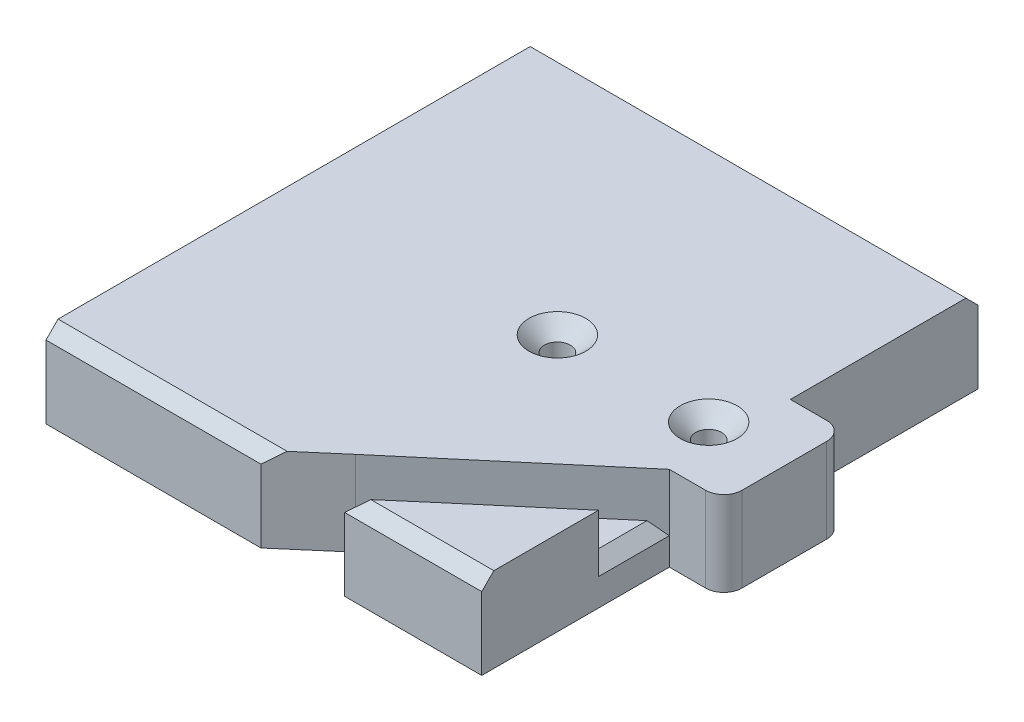
ISO-10303-21;
HEADER;
FILE_DESCRIPTION(('STEP AP214'),'2;1');
FILE_NAME('part.step','',(''),(''),'','','');
FILE_SCHEMA(('AUTOMOTIVE_DESIGN { 1 0 10303 214 1 1 1 1 }'));
ENDSEC;
DATA;
#1=APPLICATION_CONTEXT('core data for automotive mechanical design processes');
#2=APPLICATION_PROTOCOL_DEFINITION('international standard','automotive_design',2000,#1);
#3=PRODUCT_CONTEXT('',#1,'mechanical');
#4=PRODUCT('Part','Part','',(#3));
#5=PRODUCT_RELATED_PRODUCT_CATEGORY('part','',(#4));
#6=PRODUCT_DEFINITION_FORMATION('','',#4);
#7=PRODUCT_DEFINITION_CONTEXT('part definition',#1,'design');
#8=PRODUCT_DEFINITION('design','',#6,#7);
#9=PRODUCT_DEFINITION_SHAPE('','',#8);
#10=(LENGTH_UNIT() NAMED_UNIT(*) SI_UNIT(.MILLI.,.METRE.));
#11=(NAMED_UNIT(*) PLANE_ANGLE_UNIT() SI_UNIT($,.RADIAN.));
#12=(NAMED_UNIT(*) SI_UNIT($,.STERADIAN.) SOLID_ANGLE_UNIT());
#13=UNCERTAINTY_MEASURE_WITH_UNIT(LENGTH_MEASURE(1.E-05),#10,'distance_accuracy_value','');
#14=(GEOMETRIC_REPRESENTATION_CONTEXT(3) GLOBAL_UNCERTAINTY_ASSIGNED_CONTEXT((#13)) GLOBAL_UNIT_ASSIGNED_CONTEXT((#10,
#11,#12)) REPRESENTATION_CONTEXT('',''));
#15=CARTESIAN_POINT('',(0.,0.,0.));
#16=DIRECTION('',(0.,0.,1.));
#17=DIRECTION('',(1.,0.,0.));
#18=AXIS2_PLACEMENT_3D('',#15,#16,#17);
#19=CARTESIAN_POINT('',(-36.,6.99999999999999,41.));
#20=DIRECTION('',(0.,1.,0.));
#21=DIRECTION('',(0.,0.,1.));
#22=AXIS2_PLACEMENT_3D('',#19,#20,#21);
#23=PLANE('',#22);
#24=DIRECTION('',(0.,0.,-1.));
#25=VECTOR('',#24,1.);
#26=CARTESIAN_POINT('',(45.,6.99999999999999,-10.));
#27=LINE('',#26,#25);
#28=CARTESIAN_POINT('',(45.,6.99999999999999,7.));
#29=VERTEX_POINT('',#28);
#30=CARTESIAN_POINT('',(45.,6.99999999999999,-7.));
#31=VERTEX_POINT('',#30);
#32=EDGE_CURVE('E369',#29,#31,#27,.T.);
#33=ORIENTED_EDGE('',*,*,#32,.T.);
#34=CARTESIAN_POINT('',(42.,6.99999999999999,-7.));
#35=DIRECTION('',(0.,1.,0.));
#36=DIRECTION('',(0.,0.,1.));
#37=AXIS2_PLACEMENT_3D('',#34,#35,#36);
#38=CIRCLE('',#37,3.);
#39=CARTESIAN_POINT('',(42.,6.99999999999999,-10.));
#40=VERTEX_POINT('',#39);
#41=EDGE_CURVE('E462',#31,#40,#38,.T.);
#42=ORIENTED_EDGE('',*,*,#41,.T.);
#43=DIRECTION('',(-1.,0.,0.));
#44=VECTOR('',#43,1.);
#45=CARTESIAN_POINT('',(45.,6.99999999999999,-10.));
#46=LINE('',#45,#44);
#47=CARTESIAN_POINT('',(36.,6.99999999999999,-10.));
#48=VERTEX_POINT('',#47);
#49=EDGE_CURVE('E372',#40,#48,#46,.T.);
#50=ORIENTED_EDGE('',*,*,#49,.T.);
#51=DIRECTION('',(0.,0.,-1.));
#52=VECTOR('',#51,1.);
#53=CARTESIAN_POINT('',(36.,6.99999999999999,41.));
#54=LINE('',#53,#52);
#55=CARTESIAN_POINT('',(36.,6.99999999999999,-39.));
#56=VERTEX_POINT('',#55);
#57=EDGE_CURVE('E409',#48,#56,#54,.T.);
#58=ORIENTED_EDGE('',*,*,#57,.T.);
#59=DIRECTION('',(-1.,0.,0.));
#60=VECTOR('',#59,1.);
#61=CARTESIAN_POINT('',(-36.,6.99999999999999,-39.));
#62=LINE('',#61,#60);
#63=CARTESIAN_POINT('',(-36.,6.99999999999999,-39.));
#64=VERTEX_POINT('',#63);
#65=EDGE_CURVE('E420',#56,#64,#62,.T.);
#66=ORIENTED_EDGE('',*,*,#65,.T.);
#67=DIRECTION('',(0.,0.,-1.));
#68=VECTOR('',#67,1.);
#69=CARTESIAN_POINT('',(-36.,6.99999999999999,41.));
#70=LINE('',#69,#68);
#71=CARTESIAN_POINT('',(-36.,6.99999999999999,39.));
#72=VERTEX_POINT('',#71);
#73=EDGE_CURVE('E392',#72,#64,#70,.T.);
#74=ORIENTED_EDGE('',*,*,#73,.F.);
#75=DIRECTION('',(1.,0.,0.));
#76=VECTOR('',#75,1.);
#77=CARTESIAN_POINT('',(36.,6.99999999999999,39.));
#78=LINE('',#77,#76);
#79=CARTESIAN_POINT('',(1.84795055695289,6.99999999999999,39.));
#80=VERTEX_POINT('',#79);
#81=EDGE_CURVE('E417',#72,#80,#78,.T.);
#82=ORIENTED_EDGE('',*,*,#81,.T.);
#83=DIRECTION('',(-0.759147680341169,0.,0.650918427633312));
#84=VECTOR('',#83,1.);
#85=CARTESIAN_POINT('',(7.91256291111081,6.99999999999999,33.8000000000001));
#86=LINE('',#85,#84);
#87=CARTESIAN_POINT('',(7.91256291111081,6.99999999999999,33.8000000000001));
#88=VERTEX_POINT('',#87);
#89=EDGE_CURVE('E261',#88,#80,#86,.T.);
#90=ORIENTED_EDGE('',*,*,#89,.F.);
#91=DIRECTION('',(-0.762934623220006,0.,0.646475645861581));
#92=VECTOR('',#91,1.);
#93=CARTESIAN_POINT('',(7.91256291111081,6.99999999999999,33.8000000000001));
#94=LINE('',#93,#92);
#95=CARTESIAN_POINT('',(36.,6.99999999999999,10.));
#96=VERTEX_POINT('',#95);
#97=EDGE_CURVE('E256',#96,#88,#94,.T.);
#98=ORIENTED_EDGE('',*,*,#97,.F.);
#99=DIRECTION('',(1.,0.,0.));
#100=VECTOR('',#99,1.);
#101=CARTESIAN_POINT('',(45.,6.99999999999999,10.));
#102=LINE('',#101,#100);
#103=CARTESIAN_POINT('',(42.,6.99999999999999,10.));
#104=VERTEX_POINT('',#103);
#105=EDGE_CURVE('E360',#96,#104,#102,.T.);
#106=ORIENTED_EDGE('',*,*,#105,.T.);
#107=CARTESIAN_POINT('',(42.,6.99999999999999,7.));
#108=DIRECTION('',(0.,1.,0.));
#109=DIRECTION('',(0.,0.,1.));
#110=AXIS2_PLACEMENT_3D('',#107,#108,#109);
#111=CIRCLE('',#110,3.);
#112=EDGE_CURVE('E460',#104,#29,#111,.T.);
#113=ORIENTED_EDGE('',*,*,#112,.T.);
#114=EDGE_LOOP('',(#33,#42,#50,#58,#66,#74,#82,#90,#98,#106,#113));
#115=FACE_BOUND('',#114,.T.);
#116=CARTESIAN_POINT('',(32.5000000000003,6.99999999999999,0.));
#117=DIRECTION('',(0.,1.,0.));
#118=DIRECTION('',(0.,0.,1.));
#119=AXIS2_PLACEMENT_3D('',#116,#117,#118);
#120=CIRCLE('',#119,4.7);
#121=CARTESIAN_POINT('',(32.5000000000003,6.99999999999999,4.7));
#122=VERTEX_POINT('',#121);
#123=EDGE_CURVE('E335',#122,#122,#120,.T.);
#124=ORIENTED_EDGE('',*,*,#123,.F.);
#125=EDGE_LOOP('',(#124));
#126=FACE_BOUND('',#125,.T.);
#127=CARTESIAN_POINT('',(7.5000000000004,6.99999999999999,0.));
#128=DIRECTION('',(0.,1.,0.));
#129=DIRECTION('',(0.,0.,1.));
#130=AXIS2_PLACEMENT_3D('',#127,#128,#129);
#131=CIRCLE('',#130,4.7);
#132=CARTESIAN_POINT('',(7.5000000000004,6.99999999999999,4.7));
#133=VERTEX_POINT('',#132);
#134=EDGE_CURVE('E351',#133,#133,#131,.T.);
#135=ORIENTED_EDGE('',*,*,#134,.F.);
#136=EDGE_LOOP('',(#135));
#137=FACE_BOUND('',#136,.T.);
#138=ADVANCED_FACE('F38',(#115,#126,#137),#23,.T.);
#139=CARTESIAN_POINT('',(0.,0.,41.));
#140=DIRECTION('',(0.,0.,-1.));
#141=DIRECTION('',(-1.,0.,0.));
#142=AXIS2_PLACEMENT_3D('',#139,#140,#141);
#143=PLANE('',#142);
#144=DIRECTION('',(1.,0.,0.));
#145=VECTOR('',#144,1.);
#146=CARTESIAN_POINT('',(-36.,-7.00000000000001,41.));
#147=LINE('',#146,#145);
#148=CARTESIAN_POINT('',(-36.,-7.00000000000001,41.));
#149=VERTEX_POINT('',#148);
#150=CARTESIAN_POINT('',(-0.48459265618489,-7.00000000000001,41.0000000000001));
#151=VERTEX_POINT('',#150);
#152=EDGE_CURVE('E389',#149,#151,#147,.T.);
#153=ORIENTED_EDGE('',*,*,#152,.T.);
#154=DIRECTION('',(0.,1.,0.));
#155=VECTOR('',#154,1.);
#156=CARTESIAN_POINT('',(-0.48459265618489,-7.00000000000001,41.0000000000001));
#157=LINE('',#156,#155);
#158=CARTESIAN_POINT('',(-0.48459265618489,4.99999999999991,41.0000000000001));
#159=VERTEX_POINT('',#158);
#160=EDGE_CURVE('E273',#151,#159,#157,.T.);
#161=ORIENTED_EDGE('',*,*,#160,.T.);
#162=DIRECTION('',(-1.,0.,0.));
#163=VECTOR('',#162,1.);
#164=CARTESIAN_POINT('',(-36.,4.99999999999996,41.));
#165=LINE('',#164,#163);
#166=CARTESIAN_POINT('',(-36.,4.99999999999996,41.));
#167=VERTEX_POINT('',#166);
#168=EDGE_CURVE('E428',#159,#167,#165,.T.);
#169=ORIENTED_EDGE('',*,*,#168,.T.);
#170=DIRECTION('',(0.,1.,0.));
#171=VECTOR('',#170,1.);
#172=CARTESIAN_POINT('',(-36.,-7.00000000000001,41.));
#173=LINE('',#172,#171);
#174=EDGE_CURVE('E381',#149,#167,#173,.T.);
#175=ORIENTED_EDGE('',*,*,#174,.F.);
#176=EDGE_LOOP('',(#153,#161,#169,#175));
#177=FACE_BOUND('',#176,.T.);
#178=ADVANCED_FACE('F511',(#177),#143,.F.);
#179=CARTESIAN_POINT('',(-36.,6.99999999999999,39.));
#180=DIRECTION('',(0.,0.707106781186545,0.70710678118655));
#181=DIRECTION('',(-1.,0.,0.));
#182=AXIS2_PLACEMENT_3D('',#179,#180,#181);
#183=PLANE('',#182);
#184=DIRECTION('',(-0.636235386122449,-0.545529345427734,0.54552934542773));
#185=VECTOR('',#184,1.);
#186=CARTESIAN_POINT('',(-13.472728246876,-6.13645870956443,52.1364587095643));
#187=LINE('',#186,#185);
#188=EDGE_CURVE('E433',#80,#159,#187,.T.);
#189=ORIENTED_EDGE('',*,*,#188,.F.);
#190=ORIENTED_EDGE('',*,*,#81,.F.);
#191=DIRECTION('',(0.,0.70710678118655,-0.707106781186545));
#192=VECTOR('',#191,1.);
#193=CARTESIAN_POINT('',(-36.,-1.00000000000006,47.));
#194=LINE('',#193,#192);
#195=EDGE_CURVE('E422',#167,#72,#194,.T.);
#196=ORIENTED_EDGE('',*,*,#195,.F.);
#197=ORIENTED_EDGE('',*,*,#168,.F.);
#198=EDGE_LOOP('',(#189,#190,#196,#197));
#199=FACE_BOUND('',#198,.T.);
#200=ADVANCED_FACE('F504',(#199),#183,.T.);
#201=CARTESIAN_POINT('',(-28.,-7.00000000000001,-41.001));
#202=DIRECTION('',(-1.,0.,0.));
#203=DIRECTION('',(0.,0.,1.));
#204=AXIS2_PLACEMENT_3D('',#201,#202,#203);
#205=PLANE('',#204);
#206=DIRECTION('',(0.,0.,1.));
#207=VECTOR('',#206,1.);
#208=CARTESIAN_POINT('',(-28.,2.99999999999999,-41.001));
#209=LINE('',#208,#207);
#210=CARTESIAN_POINT('',(-28.,2.99999999999999,-34.));
#211=VERTEX_POINT('',#210);
#212=CARTESIAN_POINT('',(-28.,2.99999999999999,34.));
#213=VERTEX_POINT('',#212);
#214=EDGE_CURVE('E332',#211,#213,#209,.T.);
#215=ORIENTED_EDGE('',*,*,#214,.T.);
#216=DIRECTION('',(0.,1.,0.));
#217=VECTOR('',#216,1.);
#218=CARTESIAN_POINT('',(-28.,-28.1896201004171,34.));
#219=LINE('',#218,#217);
#220=CARTESIAN_POINT('',(-28.,-7.00000000000001,34.));
#221=VERTEX_POINT('',#220);
#222=EDGE_CURVE('E288',#221,#213,#219,.T.);
#223=ORIENTED_EDGE('',*,*,#222,.F.);
#224=DIRECTION('',(0.,0.,1.));
#225=VECTOR('',#224,1.);
#226=CARTESIAN_POINT('',(-28.,-7.00000000000001,-41.001));
#227=LINE('',#226,#225);
#228=CARTESIAN_POINT('',(-28.,-7.00000000000001,-34.));
#229=VERTEX_POINT('',#228);
#230=EDGE_CURVE('E331',#229,#221,#227,.T.);
#231=ORIENTED_EDGE('',*,*,#230,.F.);
#232=DIRECTION('',(0.,1.,0.));
#233=VECTOR('',#232,1.);
#234=CARTESIAN_POINT('',(-28.,-28.1896201004171,-34.));
#235=LINE('',#234,#233);
#236=EDGE_CURVE('E296',#229,#211,#235,.T.);
#237=ORIENTED_EDGE('',*,*,#236,.T.);
#238=EDGE_LOOP('',(#215,#223,#231,#237));
#239=FACE_BOUND('',#238,.T.);
#240=ADVANCED_FACE('F784',(#239),#205,.F.);
#241=CARTESIAN_POINT('',(-28.,2.99999999999999,-41.001));
#242=DIRECTION('',(0.,1.,0.));
#243=DIRECTION('',(0.,0.,1.));
#244=AXIS2_PLACEMENT_3D('',#241,#242,#243);
#245=PLANE('',#244);
#246=DIRECTION('',(0.,0.,1.));
#247=VECTOR('',#246,1.);
#248=CARTESIAN_POINT('',(-8.00000000000001,2.99999999999999,-41.001));
#249=LINE('',#248,#247);
#250=CARTESIAN_POINT('',(-8.00000000000001,2.99999999999999,-34.));
#251=VERTEX_POINT('',#250);
#252=CARTESIAN_POINT('',(-8.00000000000001,2.99999999999999,34.));
#253=VERTEX_POINT('',#252);
#254=EDGE_CURVE('E336',#251,#253,#249,.T.);
#255=ORIENTED_EDGE('',*,*,#254,.T.);
#256=DIRECTION('',(-1.,0.,0.));
#257=VECTOR('',#256,1.);
#258=CARTESIAN_POINT('',(-28.,2.99999999999999,34.));
#259=LINE('',#258,#257);
#260=EDGE_CURVE('E276',#253,#213,#259,.T.);
#261=ORIENTED_EDGE('',*,*,#260,.T.);
#262=ORIENTED_EDGE('',*,*,#214,.F.);
#263=DIRECTION('',(-1.,0.,0.));
#264=VECTOR('',#263,1.);
#265=CARTESIAN_POINT('',(-28.,2.99999999999999,-34.));
#266=LINE('',#265,#264);
#267=EDGE_CURVE('E287',#251,#211,#266,.T.);
#268=ORIENTED_EDGE('',*,*,#267,.F.);
#269=EDGE_LOOP('',(#255,#261,#262,#268));
#270=FACE_BOUND('',#269,.T.);
#271=ADVANCED_FACE('F584',(#270),#245,.F.);
#272=CARTESIAN_POINT('',(-8.00000000000001,-7.00000000000001,-41.001));
#273=DIRECTION('',(1.,0.,0.));
#274=DIRECTION('',(0.,0.,-1.));
#275=AXIS2_PLACEMENT_3D('',#272,#273,#274);
#276=PLANE('',#275);
#277=DIRECTION('',(0.,0.,1.));
#278=VECTOR('',#277,1.);
#279=CARTESIAN_POINT('',(-8.00000000000001,-7.00000000000001,-41.001));
#280=LINE('',#279,#278);
#281=CARTESIAN_POINT('',(-8.00000000000001,-6.99999999999999,-34.));
#282=VERTEX_POINT('',#281);
#283=CARTESIAN_POINT('',(-8.00000000000001,-7.00000000000001,34.));
#284=VERTEX_POINT('',#283);
#285=EDGE_CURVE('E339',#282,#284,#280,.T.);
#286=ORIENTED_EDGE('',*,*,#285,.T.);
#287=DIRECTION('',(0.,1.,0.));
#288=VECTOR('',#287,1.);
#289=CARTESIAN_POINT('',(-8.00000000000001,-28.1896201004171,34.));
#290=LINE('',#289,#288);
#291=EDGE_CURVE('E290',#284,#253,#290,.T.);
#292=ORIENTED_EDGE('',*,*,#291,.T.);
#293=ORIENTED_EDGE('',*,*,#254,.F.);
#294=DIRECTION('',(0.,1.,0.));
#295=VECTOR('',#294,1.);
#296=CARTESIAN_POINT('',(-8.00000000000001,-28.1896201004171,-34.));
#297=LINE('',#296,#295);
#298=EDGE_CURVE('E298',#282,#251,#297,.T.);
#299=ORIENTED_EDGE('',*,*,#298,.F.);
#300=EDGE_LOOP('',(#286,#292,#293,#299));
#301=FACE_BOUND('',#300,.T.);
#302=ADVANCED_FACE('F580',(#301),#276,.F.);
#303=CARTESIAN_POINT('',(-36.,-7.00000000000001,41.));
#304=DIRECTION('',(-1.,0.,0.));
#305=DIRECTION('',(0.,0.,1.));
#306=AXIS2_PLACEMENT_3D('',#303,#304,#305);
#307=PLANE('',#306);
#308=ORIENTED_EDGE('',*,*,#73,.T.);
#309=DIRECTION('',(0.,0.707106781186545,0.70710678118655));
#310=VECTOR('',#309,1.);
#311=CARTESIAN_POINT('',(-36.,40.,-5.99999999999971));
#312=LINE('',#311,#310);
#313=CARTESIAN_POINT('',(-36.,4.99999999999999,-41.));
#314=VERTEX_POINT('',#313);
#315=EDGE_CURVE('E424',#64,#314,#312,.F.);
#316=ORIENTED_EDGE('',*,*,#315,.T.);
#317=DIRECTION('',(0.,1.,0.));
#318=VECTOR('',#317,1.);
#319=CARTESIAN_POINT('',(-36.,-7.00000000000001,-41.));
#320=LINE('',#319,#318);
#321=CARTESIAN_POINT('',(-36.,-7.00000000000001,-41.));
#322=VERTEX_POINT('',#321);
#323=EDGE_CURVE('E380',#322,#314,#320,.T.);
#324=ORIENTED_EDGE('',*,*,#323,.F.);
#325=DIRECTION('',(0.,0.,-1.));
#326=VECTOR('',#325,1.);
#327=CARTESIAN_POINT('',(-36.,-7.00000000000001,41.));
#328=LINE('',#327,#326);
#329=CARTESIAN_POINT('',(-36.,-7.00000000000001,-25.));
#330=VERTEX_POINT('',#329);
#331=EDGE_CURVE('E403',#330,#322,#328,.T.);
#332=ORIENTED_EDGE('',*,*,#331,.F.);
#333=DIRECTION('',(0.,-1.,0.));
#334=VECTOR('',#333,1.);
#335=CARTESIAN_POINT('',(-36.,0.,-25.));
#336=LINE('',#335,#334);
#337=CARTESIAN_POINT('',(-36.,0.,-25.));
#338=VERTEX_POINT('',#337);
#339=EDGE_CURVE('E315',#338,#330,#336,.T.);
#340=ORIENTED_EDGE('',*,*,#339,.F.);
#341=DIRECTION('',(0.,0.,1.));
#342=VECTOR('',#341,1.);
#343=CARTESIAN_POINT('',(-36.,0.,-25.));
#344=LINE('',#343,#342);
#345=CARTESIAN_POINT('',(-36.,0.,25.));
#346=VERTEX_POINT('',#345);
#347=EDGE_CURVE('E305',#338,#346,#344,.T.);
#348=ORIENTED_EDGE('',*,*,#347,.T.);
#349=DIRECTION('',(0.,-1.,0.));
#350=VECTOR('',#349,1.);
#351=CARTESIAN_POINT('',(-36.,0.,25.));
#352=LINE('',#351,#350);
#353=CARTESIAN_POINT('',(-36.,-7.00000000000001,25.));
#354=VERTEX_POINT('',#353);
#355=EDGE_CURVE('E328',#346,#354,#352,.T.);
#356=ORIENTED_EDGE('',*,*,#355,.T.);
#357=EDGE_CURVE('E399',#149,#354,#328,.T.);
#358=ORIENTED_EDGE('',*,*,#357,.F.);
#359=ORIENTED_EDGE('',*,*,#174,.T.);
#360=ORIENTED_EDGE('',*,*,#195,.T.);
#361=EDGE_LOOP('',(#308,#316,#324,#332,#340,#348,#356,#358,#359,#360));
#362=FACE_BOUND('',#361,.T.);
#363=ADVANCED_FACE('F492',(#362),#307,.T.);
#364=CARTESIAN_POINT('',(36.,-7.00000000000001,41.));
#365=DIRECTION('',(-1.,0.,0.));
#366=DIRECTION('',(0.,0.,1.));
#367=AXIS2_PLACEMENT_3D('',#364,#365,#366);
#368=PLANE('',#367);
#369=DIRECTION('',(0.,1.,0.));
#370=VECTOR('',#369,1.);
#371=CARTESIAN_POINT('',(36.,-7.00000000000001,-41.));
#372=LINE('',#371,#370);
#373=CARTESIAN_POINT('',(36.,-7.00000000000001,-41.));
#374=VERTEX_POINT('',#373);
#375=CARTESIAN_POINT('',(36.,4.99999999999999,-41.));
#376=VERTEX_POINT('',#375);
#377=EDGE_CURVE('E395',#374,#376,#372,.T.);
#378=ORIENTED_EDGE('',*,*,#377,.T.);
#379=DIRECTION('',(0.,-0.707106781186545,-0.70710678118655));
#380=VECTOR('',#379,1.);
#381=CARTESIAN_POINT('',(36.,4.99999999999999,-41.));
#382=LINE('',#381,#380);
#383=EDGE_CURVE('E414',#376,#56,#382,.F.);
#384=ORIENTED_EDGE('',*,*,#383,.T.);
#385=ORIENTED_EDGE('',*,*,#57,.F.);
#386=DIRECTION('',(0.,1.,0.));
#387=VECTOR('',#386,1.);
#388=CARTESIAN_POINT('',(36.,-28.9317121994613,-10.));
#389=LINE('',#388,#387);
#390=CARTESIAN_POINT('',(36.,-7.00000000000001,-10.));
#391=VERTEX_POINT('',#390);
#392=EDGE_CURVE('E374',#391,#48,#389,.T.);
#393=ORIENTED_EDGE('',*,*,#392,.F.);
#394=DIRECTION('',(0.,0.,-1.));
#395=VECTOR('',#394,1.);
#396=CARTESIAN_POINT('',(36.,-7.00000000000001,41.));
#397=LINE('',#396,#395);
#398=EDGE_CURVE('E407',#391,#374,#397,.T.);
#399=ORIENTED_EDGE('',*,*,#398,.T.);
#400=EDGE_LOOP('',(#378,#384,#385,#393,#399));
#401=FACE_BOUND('',#400,.T.);
#402=ADVANCED_FACE('F483',(#401),#368,.F.);
#403=CARTESIAN_POINT('',(-36.,-7.00000000000001,41.));
#404=DIRECTION('',(0.,1.,0.));
#405=DIRECTION('',(0.,0.,1.));
#406=AXIS2_PLACEMENT_3D('',#403,#404,#405);
#407=PLANE('',#406);
#408=ORIENTED_EDGE('',*,*,#230,.T.);
#409=DIRECTION('',(1.,0.,0.));
#410=VECTOR('',#409,1.);
#411=CARTESIAN_POINT('',(-28.,-6.99999999999999,34.));
#412=LINE('',#411,#410);
#413=EDGE_CURVE('E284',#221,#284,#412,.T.);
#414=ORIENTED_EDGE('',*,*,#413,.T.);
#415=ORIENTED_EDGE('',*,*,#285,.F.);
#416=DIRECTION('',(1.,0.,0.));
#417=VECTOR('',#416,1.);
#418=CARTESIAN_POINT('',(-28.,-6.99999999999999,-34.));
#419=LINE('',#418,#417);
#420=EDGE_CURVE('E301',#229,#282,#419,.T.);
#421=ORIENTED_EDGE('',*,*,#420,.F.);
#422=EDGE_LOOP('',(#408,#414,#415,#421));
#423=FACE_BOUND('',#422,.T.);
#424=CARTESIAN_POINT('',(32.5000000000003,-6.99999999999999,0.));
#425=DIRECTION('',(0.,1.,0.));
#426=DIRECTION('',(0.,0.,1.));
#427=AXIS2_PLACEMENT_3D('',#424,#425,#426);
#428=CIRCLE('',#427,2.14999999999999);
#429=CARTESIAN_POINT('',(32.5000000000003,-6.99999999999999,2.14999999999999));
#430=VERTEX_POINT('',#429);
#431=EDGE_CURVE('E348',#430,#430,#428,.T.);
#432=ORIENTED_EDGE('',*,*,#431,.T.);
#433=EDGE_LOOP('',(#432));
#434=FACE_BOUND('',#433,.T.);
#435=CARTESIAN_POINT('',(7.5000000000004,-6.99999999999999,0.));
#436=DIRECTION('',(0.,1.,0.));
#437=DIRECTION('',(0.,0.,1.));
#438=AXIS2_PLACEMENT_3D('',#435,#436,#437);
#439=CIRCLE('',#438,2.14999999999999);
#440=CARTESIAN_POINT('',(7.5000000000004,-6.99999999999999,2.14999999999999));
#441=VERTEX_POINT('',#440);
#442=EDGE_CURVE('E357',#441,#441,#439,.T.);
#443=ORIENTED_EDGE('',*,*,#442,.T.);
#444=EDGE_LOOP('',(#443));
#445=FACE_BOUND('',#444,.T.);
#446=DIRECTION('',(1.,0.,0.));
#447=VECTOR('',#446,1.);
#448=CARTESIAN_POINT('',(45.,-6.99999999999999,-10.));
#449=LINE('',#448,#447);
#450=CARTESIAN_POINT('',(42.,-6.99999999999999,-10.));
#451=VERTEX_POINT('',#450);
#452=EDGE_CURVE('E361',#391,#451,#449,.T.);
#453=ORIENTED_EDGE('',*,*,#452,.T.);
#454=CARTESIAN_POINT('',(42.,-6.99999999999999,-7.));
#455=DIRECTION('',(0.,1.,0.));
#456=DIRECTION('',(0.,0.,1.));
#457=AXIS2_PLACEMENT_3D('',#454,#455,#456);
#458=CIRCLE('',#457,3.);
#459=CARTESIAN_POINT('',(45.,-6.99999999999999,-7.));
#460=VERTEX_POINT('',#459);
#461=EDGE_CURVE('E46',#451,#460,#458,.F.);
#462=ORIENTED_EDGE('',*,*,#461,.T.);
#463=DIRECTION('',(0.,0.,1.));
#464=VECTOR('',#463,1.);
#465=CARTESIAN_POINT('',(45.,-6.99999999999999,-10.));
#466=LINE('',#465,#464);
#467=CARTESIAN_POINT('',(45.,-6.99999999999999,7.));
#468=VERTEX_POINT('',#467);
#469=EDGE_CURVE('E366',#460,#468,#466,.T.);
#470=ORIENTED_EDGE('',*,*,#469,.T.);
#471=CARTESIAN_POINT('',(42.,-6.99999999999999,7.));
#472=DIRECTION('',(0.,1.,0.));
#473=DIRECTION('',(0.,0.,1.));
#474=AXIS2_PLACEMENT_3D('',#471,#472,#473);
#475=CIRCLE('',#474,3.);
#476=CARTESIAN_POINT('',(42.,-6.99999999999999,10.));
#477=VERTEX_POINT('',#476);
#478=EDGE_CURVE('E53',#468,#477,#475,.F.);
#479=ORIENTED_EDGE('',*,*,#478,.T.);
#480=DIRECTION('',(-1.,0.,0.));
#481=VECTOR('',#480,1.);
#482=CARTESIAN_POINT('',(45.,-6.99999999999999,10.));
#483=LINE('',#482,#481);
#484=CARTESIAN_POINT('',(36.,-7.00000000000001,10.));
#485=VERTEX_POINT('',#484);
#486=EDGE_CURVE('E363',#477,#485,#483,.T.);
#487=ORIENTED_EDGE('',*,*,#486,.T.);
#488=CARTESIAN_POINT('',(36.,-7.00000000000001,41.));
#489=VERTEX_POINT('',#488);
#490=EDGE_CURVE('E404',#489,#485,#397,.T.);
#491=ORIENTED_EDGE('',*,*,#490,.F.);
#492=CARTESIAN_POINT('',(13.3420246554855,-7.00000000000001,41.0000000000001));
#493=VERTEX_POINT('',#492);
#494=EDGE_CURVE('E388',#493,#489,#147,.T.);
#495=ORIENTED_EDGE('',*,*,#494,.F.);
#496=DIRECTION('',(0.759147680341169,0.,-0.650918427633312));
#497=VECTOR('',#496,1.);
#498=CARTESIAN_POINT('',(13.3420246554855,-7.00000000000001,41.0000000000001));
#499=LINE('',#498,#497);
#500=CARTESIAN_POINT('',(21.7391802227812,-7.00000000000001,33.8000000000001));
#501=VERTEX_POINT('',#500);
#502=EDGE_CURVE('E264',#493,#501,#499,.T.);
#503=ORIENTED_EDGE('',*,*,#502,.T.);
#504=DIRECTION('',(-1.,0.,0.));
#505=VECTOR('',#504,1.);
#506=CARTESIAN_POINT('',(7.91256291111081,-7.00000000000001,33.8000000000001));
#507=LINE('',#506,#505);
#508=CARTESIAN_POINT('',(7.91256291111081,-7.00000000000001,33.8000000000001));
#509=VERTEX_POINT('',#508);
#510=EDGE_CURVE('E517',#501,#509,#507,.T.);
#511=ORIENTED_EDGE('',*,*,#510,.T.);
#512=DIRECTION('',(-0.759147680341169,0.,0.650918427633312));
#513=VECTOR('',#512,1.);
#514=CARTESIAN_POINT('',(7.91256291111081,-7.00000000000001,33.8000000000001));
#515=LINE('',#514,#513);
#516=EDGE_CURVE('E270',#509,#151,#515,.T.);
#517=ORIENTED_EDGE('',*,*,#516,.T.);
#518=ORIENTED_EDGE('',*,*,#152,.F.);
#519=ORIENTED_EDGE('',*,*,#357,.T.);
#520=DIRECTION('',(1.,0.,0.));
#521=VECTOR('',#520,1.);
#522=CARTESIAN_POINT('',(-36.,-7.00000000000001,25.));
#523=LINE('',#522,#521);
#524=CARTESIAN_POINT('',(-30.5,-7.00000000000001,25.));
#525=VERTEX_POINT('',#524);
#526=EDGE_CURVE('E304',#354,#525,#523,.T.);
#527=ORIENTED_EDGE('',*,*,#526,.T.);
#528=DIRECTION('',(0.,0.,-1.));
#529=VECTOR('',#528,1.);
#530=CARTESIAN_POINT('',(-30.5,-7.00000000000001,-25.));
#531=LINE('',#530,#529);
#532=CARTESIAN_POINT('',(-30.5,-7.00000000000001,-25.));
#533=VERTEX_POINT('',#532);
#534=EDGE_CURVE('E318',#525,#533,#531,.T.);
#535=ORIENTED_EDGE('',*,*,#534,.T.);
#536=DIRECTION('',(-1.,0.,0.));
#537=VECTOR('',#536,1.);
#538=CARTESIAN_POINT('',(-36.,-7.00000000000001,-25.));
#539=LINE('',#538,#537);
#540=EDGE_CURVE('E309',#533,#330,#539,.T.);
#541=ORIENTED_EDGE('',*,*,#540,.T.);
#542=ORIENTED_EDGE('',*,*,#331,.T.);
#543=DIRECTION('',(1.,0.,0.));
#544=VECTOR('',#543,1.);
#545=CARTESIAN_POINT('',(-36.,-7.00000000000001,-41.));
#546=LINE('',#545,#544);
#547=EDGE_CURVE('E385',#322,#374,#546,.T.);
#548=ORIENTED_EDGE('',*,*,#547,.T.);
#549=ORIENTED_EDGE('',*,*,#398,.F.);
#550=EDGE_LOOP('',(#453,#462,#470,#479,#487,#491,#495,#503,#511,#517,#518,#519,#527,#535,#541,
#542,#548,#549));
#551=FACE_BOUND('',#550,.T.);
#552=ADVANCED_FACE('F467',(#423,#434,#445,#551),#407,.F.);
#553=DIRECTION('',(0.,1.,0.));
#554=VECTOR('',#553,1.);
#555=CARTESIAN_POINT('',(36.,-28.9317121994613,10.));
#556=LINE('',#555,#554);
#557=CARTESIAN_POINT('',(36.,-2.50000000000002,10.));
#558=VERTEX_POINT('',#557);
#559=EDGE_CURVE('E364',#485,#558,#556,.T.);
#560=ORIENTED_EDGE('',*,*,#559,.T.);
#561=DIRECTION('',(0.,0.,1.));
#562=VECTOR('',#561,1.);
#563=CARTESIAN_POINT('',(36.,-2.50000000000002,41.));
#564=LINE('',#563,#562);
#565=CARTESIAN_POINT('',(36.,-2.50000000000002,21.7160384187538));
#566=VERTEX_POINT('',#565);
#567=EDGE_CURVE('E441',#558,#566,#564,.T.);
#568=ORIENTED_EDGE('',*,*,#567,.T.);
#569=DIRECTION('',(0.,1.,0.));
#570=VECTOR('',#569,1.);
#571=CARTESIAN_POINT('',(36.,-0.5,21.7160384187538));
#572=LINE('',#571,#570);
#573=CARTESIAN_POINT('',(36.,6.99999999999999,21.7160384187538));
#574=VERTEX_POINT('',#573);
#575=EDGE_CURVE('E245',#566,#574,#572,.T.);
#576=ORIENTED_EDGE('',*,*,#575,.T.);
#577=CARTESIAN_POINT('',(36.,6.99999999999999,39.));
#578=VERTEX_POINT('',#577);
#579=EDGE_CURVE('E255',#578,#574,#54,.T.);
#580=ORIENTED_EDGE('',*,*,#579,.F.);
#581=DIRECTION('',(0.,-0.70710678118655,0.707106781186545));
#582=VECTOR('',#581,1.);
#583=CARTESIAN_POINT('',(36.,6.99999999999999,39.));
#584=LINE('',#583,#582);
#585=CARTESIAN_POINT('',(36.,4.99999999999996,41.));
#586=VERTEX_POINT('',#585);
#587=EDGE_CURVE('E426',#578,#586,#584,.T.);
#588=ORIENTED_EDGE('',*,*,#587,.T.);
#589=DIRECTION('',(0.,1.,0.));
#590=VECTOR('',#589,1.);
#591=CARTESIAN_POINT('',(36.,-7.00000000000001,41.));
#592=LINE('',#591,#590);
#593=EDGE_CURVE('E384',#489,#586,#592,.T.);
#594=ORIENTED_EDGE('',*,*,#593,.F.);
#595=ORIENTED_EDGE('',*,*,#490,.T.);
#596=EDGE_LOOP('',(#560,#568,#576,#580,#588,#594,#595));
#597=FACE_BOUND('',#596,.T.);
#598=ADVANCED_FACE('F564',(#597),#368,.F.);
#599=DIRECTION('',(0.762934623220006,0.,-0.646475645861581));
#600=VECTOR('',#599,1.);
#601=CARTESIAN_POINT('',(36.,6.99999999999999,21.7160384187538));
#602=LINE('',#601,#600);
#603=CARTESIAN_POINT('',(21.7391802227812,6.99999999999999,33.8000000000001));
#604=VERTEX_POINT('',#603);
#605=EDGE_CURVE('E237',#604,#574,#602,.T.);
#606=ORIENTED_EDGE('',*,*,#605,.F.);
#607=DIRECTION('',(0.759147680341169,0.,-0.650918427633312));
#608=VECTOR('',#607,1.);
#609=CARTESIAN_POINT('',(13.3420246554855,6.99999999999999,41.0000000000001));
#610=LINE('',#609,#608);
#611=CARTESIAN_POINT('',(15.6745678686233,6.99999999999999,39.));
#612=VERTEX_POINT('',#611);
#613=EDGE_CURVE('E252',#612,#604,#610,.T.);
#614=ORIENTED_EDGE('',*,*,#613,.F.);
#615=EDGE_CURVE('E416',#612,#578,#78,.T.);
#616=ORIENTED_EDGE('',*,*,#615,.T.);
#617=ORIENTED_EDGE('',*,*,#579,.T.);
#618=EDGE_LOOP('',(#606,#614,#616,#617));
#619=FACE_BOUND('',#618,.T.);
#620=ADVANCED_FACE('F251',(#619),#23,.T.);
#621=CARTESIAN_POINT('',(13.3420246554855,4.99999999999996,41.));
#622=VERTEX_POINT('',#621);
#623=EDGE_CURVE('E429',#586,#622,#165,.T.);
#624=ORIENTED_EDGE('',*,*,#623,.T.);
#625=DIRECTION('',(0.,1.,0.));
#626=VECTOR('',#625,1.);
#627=CARTESIAN_POINT('',(13.3420246554855,-7.00000000000001,41.0000000000001));
#628=LINE('',#627,#626);
#629=EDGE_CURVE('E282',#493,#622,#628,.T.);
#630=ORIENTED_EDGE('',*,*,#629,.F.);
#631=ORIENTED_EDGE('',*,*,#494,.T.);
#632=ORIENTED_EDGE('',*,*,#593,.T.);
#633=EDGE_LOOP('',(#624,#630,#631,#632));
#634=FACE_BOUND('',#633,.T.);
#635=ADVANCED_FACE('F560',(#634),#143,.F.);
#636=CARTESIAN_POINT('',(0.,0.,-41.));
#637=DIRECTION('',(0.,0.,-1.));
#638=DIRECTION('',(-1.,0.,0.));
#639=AXIS2_PLACEMENT_3D('',#636,#637,#638);
#640=PLANE('',#639);
#641=ORIENTED_EDGE('',*,*,#377,.F.);
#642=ORIENTED_EDGE('',*,*,#547,.F.);
#643=ORIENTED_EDGE('',*,*,#323,.T.);
#644=DIRECTION('',(1.,0.,0.));
#645=VECTOR('',#644,1.);
#646=CARTESIAN_POINT('',(0.,4.99999999999999,-41.));
#647=LINE('',#646,#645);
#648=EDGE_CURVE('E402',#314,#376,#647,.T.);
#649=ORIENTED_EDGE('',*,*,#648,.T.);
#650=EDGE_LOOP('',(#641,#642,#643,#649));
#651=FACE_BOUND('',#650,.T.);
#652=ADVANCED_FACE('F489',(#651),#640,.T.);
#653=CARTESIAN_POINT('',(45.,-28.9317121994613,10.));
#654=DIRECTION('',(0.,0.,1.));
#655=DIRECTION('',(1.,0.,0.));
#656=AXIS2_PLACEMENT_3D('',#653,#654,#655);
#657=PLANE('',#656);
#658=ORIENTED_EDGE('',*,*,#486,.F.);
#659=DIRECTION('',(0.,1.,0.));
#660=VECTOR('',#659,1.);
#661=CARTESIAN_POINT('',(42.,-28.9317121994613,10.));
#662=LINE('',#661,#660);
#663=EDGE_CURVE('E11',#477,#104,#662,.T.);
#664=ORIENTED_EDGE('',*,*,#663,.T.);
#665=ORIENTED_EDGE('',*,*,#105,.F.);
#666=DIRECTION('',(0.,1.,0.));
#667=VECTOR('',#666,1.);
#668=CARTESIAN_POINT('',(36.,-0.5,10.));
#669=LINE('',#668,#667);
#670=EDGE_CURVE('E267',#558,#96,#669,.T.);
#671=ORIENTED_EDGE('',*,*,#670,.F.);
#672=ORIENTED_EDGE('',*,*,#559,.F.);
#673=EDGE_LOOP('',(#658,#664,#665,#671,#672));
#674=FACE_BOUND('',#673,.T.);
#675=ADVANCED_FACE('F546',(#674),#657,.T.);
#676=CARTESIAN_POINT('',(45.,-28.9317121994613,-10.));
#677=DIRECTION('',(0.,0.,-1.));
#678=DIRECTION('',(-1.,0.,0.));
#679=AXIS2_PLACEMENT_3D('',#676,#677,#678);
#680=PLANE('',#679);
#681=ORIENTED_EDGE('',*,*,#49,.F.);
#682=DIRECTION('',(0.,1.,0.));
#683=VECTOR('',#682,1.);
#684=CARTESIAN_POINT('',(42.,-28.9317121994613,-10.));
#685=LINE('',#684,#683);
#686=EDGE_CURVE('E61',#40,#451,#685,.F.);
#687=ORIENTED_EDGE('',*,*,#686,.T.);
#688=ORIENTED_EDGE('',*,*,#452,.F.);
#689=ORIENTED_EDGE('',*,*,#392,.T.);
#690=EDGE_LOOP('',(#681,#687,#688,#689));
#691=FACE_BOUND('',#690,.T.);
#692=ADVANCED_FACE('F480',(#691),#680,.T.);
#693=CARTESIAN_POINT('',(45.,-28.9317121994613,-10.));
#694=DIRECTION('',(1.,0.,0.));
#695=DIRECTION('',(0.,0.,-1.));
#696=AXIS2_PLACEMENT_3D('',#693,#694,#695);
#697=PLANE('',#696);
#698=ORIENTED_EDGE('',*,*,#469,.F.);
#699=DIRECTION('',(0.,1.,0.));
#700=VECTOR('',#699,1.);
#701=CARTESIAN_POINT('',(45.,-28.9317121994613,-7.));
#702=LINE('',#701,#700);
#703=EDGE_CURVE('E457',#460,#31,#702,.T.);
#704=ORIENTED_EDGE('',*,*,#703,.T.);
#705=ORIENTED_EDGE('',*,*,#32,.F.);
#706=DIRECTION('',(0.,1.,0.));
#707=VECTOR('',#706,1.);
#708=CARTESIAN_POINT('',(45.,-28.9317121994613,7.));
#709=LINE('',#708,#707);
#710=EDGE_CURVE('E455',#29,#468,#709,.F.);
#711=ORIENTED_EDGE('',*,*,#710,.T.);
#712=EDGE_LOOP('',(#698,#704,#705,#711));
#713=FACE_BOUND('',#712,.T.);
#714=ADVANCED_FACE('F472',(#713),#697,.T.);
#715=CARTESIAN_POINT('',(7.5000000000004,6.99999999999999,0.));
#716=DIRECTION('',(0.,1.,0.));
#717=DIRECTION('',(0.,0.,1.));
#718=AXIS2_PLACEMENT_3D('',#715,#716,#717);
#719=CYLINDRICAL_SURFACE('',#718,2.14999999999999);
#720=ORIENTED_EDGE('',*,*,#442,.F.);
#721=EDGE_LOOP('',(#720));
#722=FACE_BOUND('',#721,.T.);
#723=CARTESIAN_POINT('',(7.5000000000004,4.45,0.));
#724=DIRECTION('',(0.,1.,0.));
#725=DIRECTION('',(0.,0.,1.));
#726=AXIS2_PLACEMENT_3D('',#723,#724,#725);
#727=CIRCLE('',#726,2.15);
#728=CARTESIAN_POINT('',(7.5000000000004,4.45,2.15));
#729=VERTEX_POINT('',#728);
#730=EDGE_CURVE('E354',#729,#729,#727,.T.);
#731=ORIENTED_EDGE('',*,*,#730,.T.);
#732=EDGE_LOOP('',(#731));
#733=FACE_BOUND('',#732,.T.);
#734=ADVANCED_FACE('F731',(#722,#733),#719,.F.);
#735=CARTESIAN_POINT('',(7.5000000000004,6.99999999999999,0.));
#736=DIRECTION('',(0.,1.,0.));
#737=DIRECTION('',(0.,0.,1.));
#738=AXIS2_PLACEMENT_3D('',#735,#736,#737);
#739=CONICAL_SURFACE('',#738,4.7,0.785398163397448);
#740=ORIENTED_EDGE('',*,*,#730,.F.);
#741=EDGE_LOOP('',(#740));
#742=FACE_BOUND('',#741,.T.);
#743=ORIENTED_EDGE('',*,*,#134,.T.);
#744=EDGE_LOOP('',(#743));
#745=FACE_BOUND('',#744,.T.);
#746=ADVANCED_FACE('F723',(#742,#745),#739,.F.);
#747=CARTESIAN_POINT('',(32.5000000000003,6.99999999999999,0.));
#748=DIRECTION('',(0.,1.,0.));
#749=DIRECTION('',(0.,0.,1.));
#750=AXIS2_PLACEMENT_3D('',#747,#748,#749);
#751=CYLINDRICAL_SURFACE('',#750,2.14999999999999);
#752=ORIENTED_EDGE('',*,*,#431,.F.);
#753=EDGE_LOOP('',(#752));
#754=FACE_BOUND('',#753,.T.);
#755=CARTESIAN_POINT('',(32.5000000000003,4.45,0.));
#756=DIRECTION('',(0.,1.,0.));
#757=DIRECTION('',(0.,0.,1.));
#758=AXIS2_PLACEMENT_3D('',#755,#756,#757);
#759=CIRCLE('',#758,2.15);
#760=CARTESIAN_POINT('',(32.5000000000003,4.45,2.15));
#761=VERTEX_POINT('',#760);
#762=EDGE_CURVE('E345',#761,#761,#759,.T.);
#763=ORIENTED_EDGE('',*,*,#762,.T.);
#764=EDGE_LOOP('',(#763));
#765=FACE_BOUND('',#764,.T.);
#766=ADVANCED_FACE('F715',(#754,#765),#751,.F.);
#767=CARTESIAN_POINT('',(32.5000000000003,6.99999999999999,0.));
#768=DIRECTION('',(0.,1.,0.));
#769=DIRECTION('',(0.,0.,1.));
#770=AXIS2_PLACEMENT_3D('',#767,#768,#769);
#771=CONICAL_SURFACE('',#770,4.7,0.785398163397447);
#772=ORIENTED_EDGE('',*,*,#762,.F.);
#773=EDGE_LOOP('',(#772));
#774=FACE_BOUND('',#773,.T.);
#775=ORIENTED_EDGE('',*,*,#123,.T.);
#776=EDGE_LOOP('',(#775));
#777=FACE_BOUND('',#776,.T.);
#778=ADVANCED_FACE('F707',(#774,#777),#771,.F.);
#779=CARTESIAN_POINT('',(-36.,0.,25.));
#780=DIRECTION('',(0.,0.,-1.));
#781=DIRECTION('',(-1.,0.,0.));
#782=AXIS2_PLACEMENT_3D('',#779,#780,#781);
#783=PLANE('',#782);
#784=ORIENTED_EDGE('',*,*,#526,.F.);
#785=ORIENTED_EDGE('',*,*,#355,.F.);
#786=DIRECTION('',(1.,0.,0.));
#787=VECTOR('',#786,1.);
#788=CARTESIAN_POINT('',(-36.,0.,25.));
#789=LINE('',#788,#787);
#790=CARTESIAN_POINT('',(-30.5,0.,25.));
#791=VERTEX_POINT('',#790);
#792=EDGE_CURVE('E308',#346,#791,#789,.T.);
#793=ORIENTED_EDGE('',*,*,#792,.T.);
#794=DIRECTION('',(0.,-1.,0.));
#795=VECTOR('',#794,1.);
#796=CARTESIAN_POINT('',(-30.5,0.,25.));
#797=LINE('',#796,#795);
#798=EDGE_CURVE('E326',#791,#525,#797,.T.);
#799=ORIENTED_EDGE('',*,*,#798,.T.);
#800=EDGE_LOOP('',(#784,#785,#793,#799));
#801=FACE_BOUND('',#800,.T.);
#802=ADVANCED_FACE('F699',(#801),#783,.T.);
#803=CARTESIAN_POINT('',(-30.5,0.,-25.));
#804=DIRECTION('',(-1.,0.,0.));
#805=DIRECTION('',(0.,0.,1.));
#806=AXIS2_PLACEMENT_3D('',#803,#804,#805);
#807=PLANE('',#806);
#808=ORIENTED_EDGE('',*,*,#534,.F.);
#809=ORIENTED_EDGE('',*,*,#798,.F.);
#810=DIRECTION('',(0.,0.,-1.));
#811=VECTOR('',#810,1.);
#812=CARTESIAN_POINT('',(-30.5,0.,-25.));
#813=LINE('',#812,#811);
#814=CARTESIAN_POINT('',(-30.5,0.,-25.));
#815=VERTEX_POINT('',#814);
#816=EDGE_CURVE('E311',#791,#815,#813,.T.);
#817=ORIENTED_EDGE('',*,*,#816,.T.);
#818=DIRECTION('',(0.,-1.,0.));
#819=VECTOR('',#818,1.);
#820=CARTESIAN_POINT('',(-30.5,0.,-25.));
#821=LINE('',#820,#819);
#822=EDGE_CURVE('E324',#815,#533,#821,.T.);
#823=ORIENTED_EDGE('',*,*,#822,.T.);
#824=EDGE_LOOP('',(#808,#809,#817,#823));
#825=FACE_BOUND('',#824,.T.);
#826=ADVANCED_FACE('F691',(#825),#807,.T.);
#827=CARTESIAN_POINT('',(-36.,0.,-25.));
#828=DIRECTION('',(0.,0.,1.));
#829=DIRECTION('',(1.,0.,0.));
#830=AXIS2_PLACEMENT_3D('',#827,#828,#829);
#831=PLANE('',#830);
#832=ORIENTED_EDGE('',*,*,#540,.F.);
#833=ORIENTED_EDGE('',*,*,#822,.F.);
#834=DIRECTION('',(-1.,0.,0.));
#835=VECTOR('',#834,1.);
#836=CARTESIAN_POINT('',(-36.,0.,-25.));
#837=LINE('',#836,#835);
#838=EDGE_CURVE('E313',#815,#338,#837,.T.);
#839=ORIENTED_EDGE('',*,*,#838,.T.);
#840=ORIENTED_EDGE('',*,*,#339,.T.);
#841=EDGE_LOOP('',(#832,#833,#839,#840));
#842=FACE_BOUND('',#841,.T.);
#843=ADVANCED_FACE('F683',(#842),#831,.T.);
#844=CARTESIAN_POINT('',(0.,0.,0.));
#845=DIRECTION('',(0.,1.,0.));
#846=DIRECTION('',(0.,0.,1.));
#847=AXIS2_PLACEMENT_3D('',#844,#845,#846);
#848=PLANE('',#847);
#849=ORIENTED_EDGE('',*,*,#347,.F.);
#850=ORIENTED_EDGE('',*,*,#838,.F.);
#851=ORIENTED_EDGE('',*,*,#816,.F.);
#852=ORIENTED_EDGE('',*,*,#792,.F.);
#853=EDGE_LOOP('',(#849,#850,#851,#852));
#854=FACE_BOUND('',#853,.T.);
#855=ADVANCED_FACE('F591',(#854),#848,.F.);
#856=CARTESIAN_POINT('',(0.,4.99999999999999,-41.));
#857=DIRECTION('',(0.,-0.70710678118655,0.707106781186545));
#858=DIRECTION('',(1.,0.,0.));
#859=AXIS2_PLACEMENT_3D('',#856,#857,#858);
#860=PLANE('',#859);
#861=ORIENTED_EDGE('',*,*,#315,.F.);
#862=ORIENTED_EDGE('',*,*,#65,.F.);
#863=ORIENTED_EDGE('',*,*,#383,.F.);
#864=ORIENTED_EDGE('',*,*,#648,.F.);
#865=EDGE_LOOP('',(#861,#862,#863,#864));
#866=FACE_BOUND('',#865,.T.);
#867=ADVANCED_FACE('F498',(#866),#860,.F.);
#868=DIRECTION('',(0.636235386122449,0.545529345427734,-0.54552934542773));
#869=VECTOR('',#868,1.);
#870=CARTESIAN_POINT('',(-5.24306294075214,-10.9354711986129,56.9354711986128));
#871=LINE('',#870,#869);
#872=EDGE_CURVE('E260',#622,#612,#871,.T.);
#873=ORIENTED_EDGE('',*,*,#872,.F.);
#874=ORIENTED_EDGE('',*,*,#623,.F.);
#875=ORIENTED_EDGE('',*,*,#587,.F.);
#876=ORIENTED_EDGE('',*,*,#615,.F.);
#877=EDGE_LOOP('',(#873,#874,#875,#876));
#878=FACE_BOUND('',#877,.T.);
#879=ADVANCED_FACE('F590',(#878),#183,.T.);
#880=CARTESIAN_POINT('',(-28.,-28.1896201004171,-34.));
#881=DIRECTION('',(0.,0.,-1.));
#882=DIRECTION('',(-1.,0.,0.));
#883=AXIS2_PLACEMENT_3D('',#880,#881,#882);
#884=PLANE('',#883);
#885=ORIENTED_EDGE('',*,*,#236,.F.);
#886=ORIENTED_EDGE('',*,*,#420,.T.);
#887=ORIENTED_EDGE('',*,*,#298,.T.);
#888=ORIENTED_EDGE('',*,*,#267,.T.);
#889=EDGE_LOOP('',(#885,#886,#887,#888));
#890=FACE_BOUND('',#889,.T.);
#891=ADVANCED_FACE('F594',(#890),#884,.F.);
#892=CARTESIAN_POINT('',(-28.,-28.1896201004171,34.));
#893=DIRECTION('',(0.,0.,-1.));
#894=DIRECTION('',(-1.,0.,0.));
#895=AXIS2_PLACEMENT_3D('',#892,#893,#894);
#896=PLANE('',#895);
#897=ORIENTED_EDGE('',*,*,#413,.F.);
#898=ORIENTED_EDGE('',*,*,#222,.T.);
#899=ORIENTED_EDGE('',*,*,#260,.F.);
#900=ORIENTED_EDGE('',*,*,#291,.F.);
#901=EDGE_LOOP('',(#897,#898,#899,#900));
#902=FACE_BOUND('',#901,.T.);
#903=ADVANCED_FACE('F648',(#902),#896,.T.);
#904=CARTESIAN_POINT('',(7.91256291111081,-7.00000000000001,33.8000000000001));
#905=DIRECTION('',(-0.650918427633312,0.,-0.759147680341169));
#906=DIRECTION('',(-0.759147680341169,0.,0.650918427633312));
#907=AXIS2_PLACEMENT_3D('',#904,#905,#906);
#908=PLANE('',#907);
#909=ORIENTED_EDGE('',*,*,#188,.T.);
#910=ORIENTED_EDGE('',*,*,#160,.F.);
#911=ORIENTED_EDGE('',*,*,#516,.F.);
#912=DIRECTION('',(0.,1.,0.));
#913=VECTOR('',#912,1.);
#914=CARTESIAN_POINT('',(7.91256291111081,-7.00000000000001,33.8000000000001));
#915=LINE('',#914,#913);
#916=CARTESIAN_POINT('',(7.91256291111081,-2.50000000000002,33.8000000000001));
#917=VERTEX_POINT('',#916);
#918=EDGE_CURVE('E277',#509,#917,#915,.T.);
#919=ORIENTED_EDGE('',*,*,#918,.T.);
#920=DIRECTION('',(0.,1.,0.));
#921=VECTOR('',#920,1.);
#922=CARTESIAN_POINT('',(7.91256291111081,-0.5,33.8000000000001));
#923=LINE('',#922,#921);
#924=EDGE_CURVE('E262',#917,#88,#923,.T.);
#925=ORIENTED_EDGE('',*,*,#924,.T.);
#926=ORIENTED_EDGE('',*,*,#89,.T.);
#927=EDGE_LOOP('',(#909,#910,#911,#919,#925,#926));
#928=FACE_BOUND('',#927,.T.);
#929=ADVANCED_FACE('F507',(#928),#908,.F.);
#930=CARTESIAN_POINT('',(7.91256291111081,-7.00000000000001,33.8000000000001));
#931=DIRECTION('',(0.,0.,-1.));
#932=DIRECTION('',(-1.,0.,0.));
#933=AXIS2_PLACEMENT_3D('',#930,#931,#932);
#934=PLANE('',#933);
#935=DIRECTION('',(0.,1.,0.));
#936=VECTOR('',#935,1.);
#937=CARTESIAN_POINT('',(21.7391802227812,-7.00000000000001,33.8000000000001));
#938=LINE('',#937,#936);
#939=CARTESIAN_POINT('',(21.7391802227812,-2.50000000000002,33.8000000000001));
#940=VERTEX_POINT('',#939);
#941=EDGE_CURVE('E280',#501,#940,#938,.T.);
#942=ORIENTED_EDGE('',*,*,#941,.T.);
#943=DIRECTION('',(-1.,0.,0.));
#944=VECTOR('',#943,1.);
#945=CARTESIAN_POINT('',(7.91256291111081,-2.50000000000002,33.8000000000001));
#946=LINE('',#945,#944);
#947=EDGE_CURVE('E444',#940,#917,#946,.T.);
#948=ORIENTED_EDGE('',*,*,#947,.T.);
#949=ORIENTED_EDGE('',*,*,#918,.F.);
#950=ORIENTED_EDGE('',*,*,#510,.F.);
#951=EDGE_LOOP('',(#942,#948,#949,#950));
#952=FACE_BOUND('',#951,.T.);
#953=ADVANCED_FACE('F543',(#952),#934,.F.);
#954=CARTESIAN_POINT('',(13.3420246554855,-7.00000000000001,41.0000000000001));
#955=DIRECTION('',(0.650918427633312,0.,0.759147680341169));
#956=DIRECTION('',(0.759147680341169,0.,-0.650918427633312));
#957=AXIS2_PLACEMENT_3D('',#954,#955,#956);
#958=PLANE('',#957);
#959=ORIENTED_EDGE('',*,*,#872,.T.);
#960=ORIENTED_EDGE('',*,*,#613,.T.);
#961=DIRECTION('',(0.,1.,0.));
#962=VECTOR('',#961,1.);
#963=CARTESIAN_POINT('',(21.7391802227812,-0.5,33.8000000000001));
#964=LINE('',#963,#962);
#965=EDGE_CURVE('E234',#940,#604,#964,.T.);
#966=ORIENTED_EDGE('',*,*,#965,.F.);
#967=ORIENTED_EDGE('',*,*,#941,.F.);
#968=ORIENTED_EDGE('',*,*,#502,.F.);
#969=ORIENTED_EDGE('',*,*,#629,.T.);
#970=EDGE_LOOP('',(#959,#960,#966,#967,#968,#969));
#971=FACE_BOUND('',#970,.T.);
#972=ADVANCED_FACE('F258',(#971),#958,.F.);
#973=CARTESIAN_POINT('',(7.91256291111081,-0.5,33.8000000000001));
#974=DIRECTION('',(-0.646475645861581,0.,-0.762934623220006));
#975=DIRECTION('',(-0.762934623220006,0.,0.646475645861581));
#976=AXIS2_PLACEMENT_3D('',#973,#974,#975);
#977=PLANE('',#976);
#978=ORIENTED_EDGE('',*,*,#97,.T.);
#979=ORIENTED_EDGE('',*,*,#924,.F.);
#980=DIRECTION('',(-0.640707506536948,-0.542906019061868,0.542906019061864));
#981=VECTOR('',#980,1.);
#982=CARTESIAN_POINT('',(8.60825083462485,-1.9105061089328,33.2105061089328));
#983=LINE('',#982,#981);
#984=CARTESIAN_POINT('',(10.2728517421099,-0.5,31.8000000000001));
#985=VERTEX_POINT('',#984);
#986=EDGE_CURVE('E453',#917,#985,#983,.F.);
#987=ORIENTED_EDGE('',*,*,#986,.T.);
#988=DIRECTION('',(-0.762934623220006,0.,0.646475645861581));
#989=VECTOR('',#988,1.);
#990=CARTESIAN_POINT('',(7.91256291111081,-0.5,33.8000000000001));
#991=LINE('',#990,#989);
#992=CARTESIAN_POINT('',(34.,-0.5,11.6947078456948));
#993=VERTEX_POINT('',#992);
#994=EDGE_CURVE('E246',#993,#985,#991,.T.);
#995=ORIENTED_EDGE('',*,*,#994,.F.);
#996=DIRECTION('',(-0.606561136891955,0.606561136891959,0.513971958792182));
#997=VECTOR('',#996,1.);
#998=CARTESIAN_POINT('',(17.5105591836788,15.9894408163213,25.6671002069647));
#999=LINE('',#998,#997);
#1000=EDGE_CURVE('E447',#993,#558,#999,.F.);
#1001=ORIENTED_EDGE('',*,*,#1000,.T.);
#1002=ORIENTED_EDGE('',*,*,#670,.T.);
#1003=EDGE_LOOP('',(#978,#979,#987,#995,#1001,#1002));
#1004=FACE_BOUND('',#1003,.T.);
#1005=ADVANCED_FACE('F537',(#1004),#977,.F.);
#1006=CARTESIAN_POINT('',(36.,-0.5,21.7160384187538));
#1007=DIRECTION('',(0.646475645861581,0.,0.762934623220006));
#1008=DIRECTION('',(0.762934623220006,0.,-0.646475645861581));
#1009=AXIS2_PLACEMENT_3D('',#1006,#1007,#1008);
#1010=PLANE('',#1009);
#1011=ORIENTED_EDGE('',*,*,#605,.T.);
#1012=ORIENTED_EDGE('',*,*,#575,.F.);
#1013=DIRECTION('',(0.606561136891955,-0.606561136891959,-0.513971958792182));
#1014=VECTOR('',#1013,1.);
#1015=CARTESIAN_POINT('',(35.2641671744247,-1.76416717442468,22.3395492500649));
#1016=LINE('',#1015,#1014);
#1017=CARTESIAN_POINT('',(34.,-0.5,23.4107462644486));
#1018=VERTEX_POINT('',#1017);
#1019=EDGE_CURVE('E450',#566,#1018,#1016,.F.);
#1020=ORIENTED_EDGE('',*,*,#1019,.T.);
#1021=DIRECTION('',(0.762934623220006,0.,-0.646475645861581));
#1022=VECTOR('',#1021,1.);
#1023=CARTESIAN_POINT('',(36.,-0.5,21.7160384187538));
#1024=LINE('',#1023,#1022);
#1025=CARTESIAN_POINT('',(24.0994690537802,-0.5,31.8000000000001));
#1026=VERTEX_POINT('',#1025);
#1027=EDGE_CURVE('E522',#1026,#1018,#1024,.T.);
#1028=ORIENTED_EDGE('',*,*,#1027,.F.);
#1029=DIRECTION('',(0.640707506536948,0.542906019061868,-0.542906019061864));
#1030=VECTOR('',#1029,1.);
#1031=CARTESIAN_POINT('',(32.4923548533736,6.61174470629576,24.6882552937043));
#1032=LINE('',#1031,#1030);
#1033=EDGE_CURVE('E240',#1026,#940,#1032,.F.);
#1034=ORIENTED_EDGE('',*,*,#1033,.T.);
#1035=ORIENTED_EDGE('',*,*,#965,.T.);
#1036=EDGE_LOOP('',(#1011,#1012,#1020,#1028,#1034,#1035));
#1037=FACE_BOUND('',#1036,.T.);
#1038=ADVANCED_FACE('F236',(#1037),#1010,.F.);
#1039=CARTESIAN_POINT('',(0.,-0.5,0.));
#1040=DIRECTION('',(0.,-1.,0.));
#1041=DIRECTION('',(0.,0.,-1.));
#1042=AXIS2_PLACEMENT_3D('',#1039,#1040,#1041);
#1043=PLANE('',#1042);
#1044=ORIENTED_EDGE('',*,*,#1027,.T.);
#1045=DIRECTION('',(0.,0.,-1.));
#1046=VECTOR('',#1045,1.);
#1047=CARTESIAN_POINT('',(34.,-0.5,0.));
#1048=LINE('',#1047,#1046);
#1049=EDGE_CURVE('E438',#1018,#993,#1048,.T.);
#1050=ORIENTED_EDGE('',*,*,#1049,.T.);
#1051=ORIENTED_EDGE('',*,*,#994,.T.);
#1052=DIRECTION('',(1.,0.,0.));
#1053=VECTOR('',#1052,1.);
#1054=CARTESIAN_POINT('',(0.,-0.5,31.8000000000001));
#1055=LINE('',#1054,#1053);
#1056=EDGE_CURVE('E435',#985,#1026,#1055,.T.);
#1057=ORIENTED_EDGE('',*,*,#1056,.T.);
#1058=EDGE_LOOP('',(#1044,#1050,#1051,#1057));
#1059=FACE_BOUND('',#1058,.T.);
#1060=ADVANCED_FACE('F529',(#1059),#1043,.F.);
#1061=CARTESIAN_POINT('',(34.,-0.5,0.));
#1062=DIRECTION('',(-0.70710678118655,-0.707106781186545,0.));
#1063=DIRECTION('',(0.,0.,-1.));
#1064=AXIS2_PLACEMENT_3D('',#1061,#1062,#1063);
#1065=PLANE('',#1064);
#1066=ORIENTED_EDGE('',*,*,#1019,.F.);
#1067=ORIENTED_EDGE('',*,*,#567,.F.);
#1068=ORIENTED_EDGE('',*,*,#1000,.F.);
#1069=ORIENTED_EDGE('',*,*,#1049,.F.);
#1070=EDGE_LOOP('',(#1066,#1067,#1068,#1069));
#1071=FACE_BOUND('',#1070,.T.);
#1072=ADVANCED_FACE('F534',(#1071),#1065,.F.);
#1073=CARTESIAN_POINT('',(0.,-0.5,31.8000000000001));
#1074=DIRECTION('',(0.,-0.707106781186545,-0.70710678118655));
#1075=DIRECTION('',(1.,0.,0.));
#1076=AXIS2_PLACEMENT_3D('',#1073,#1074,#1075);
#1077=PLANE('',#1076);
#1078=ORIENTED_EDGE('',*,*,#986,.F.);
#1079=ORIENTED_EDGE('',*,*,#947,.F.);
#1080=ORIENTED_EDGE('',*,*,#1033,.F.);
#1081=ORIENTED_EDGE('',*,*,#1056,.F.);
#1082=EDGE_LOOP('',(#1078,#1079,#1080,#1081));
#1083=FACE_BOUND('',#1082,.T.);
#1084=ADVANCED_FACE('F541',(#1083),#1077,.F.);
#1085=CARTESIAN_POINT('',(42.,-28.9317121994613,-7.));
#1086=DIRECTION('',(0.,1.,0.));
#1087=DIRECTION('',(0.,0.,1.));
#1088=AXIS2_PLACEMENT_3D('',#1085,#1086,#1087);
#1089=CYLINDRICAL_SURFACE('',#1088,3.);
#1090=ORIENTED_EDGE('',*,*,#461,.F.);
#1091=ORIENTED_EDGE('',*,*,#686,.F.);
#1092=ORIENTED_EDGE('',*,*,#41,.F.);
#1093=ORIENTED_EDGE('',*,*,#703,.F.);
#1094=EDGE_LOOP('',(#1090,#1091,#1092,#1093));
#1095=FACE_BOUND('',#1094,.T.);
#1096=ADVANCED_FACE('F475',(#1095),#1089,.T.);
#1097=CARTESIAN_POINT('',(42.,-28.9317121994613,7.));
#1098=DIRECTION('',(0.,1.,0.));
#1099=DIRECTION('',(0.,0.,1.));
#1100=AXIS2_PLACEMENT_3D('',#1097,#1098,#1099);
#1101=CYLINDRICAL_SURFACE('',#1100,3.);
#1102=ORIENTED_EDGE('',*,*,#478,.F.);
#1103=ORIENTED_EDGE('',*,*,#710,.F.);
#1104=ORIENTED_EDGE('',*,*,#112,.F.);
#1105=ORIENTED_EDGE('',*,*,#663,.F.);
#1106=EDGE_LOOP('',(#1102,#1103,#1104,#1105));
#1107=FACE_BOUND('',#1106,.T.);
#1108=ADVANCED_FACE('F40',(#1107),#1101,.T.);
#1109=CLOSED_SHELL('',(#138,#178,#200,#240,#271,#302,#363,#402,#552,#598,#620,#635,#652,#675,
#692,#714,#734,#746,#766,#778,#802,#826,#843,#855,#867,#879,#891,#903,#929,#953,#972,#1005,
#1038,#1060,#1072,#1084,#1096,#1108));
#1110=MANIFOLD_SOLID_BREP('B2',#1109);
#1111=ADVANCED_BREP_SHAPE_REPRESENTATION('',(#18,#1110),#14);
#1112=SHAPE_DEFINITION_REPRESENTATION(#9,#1111);
ENDSEC;
END-ISO-10303-21;
